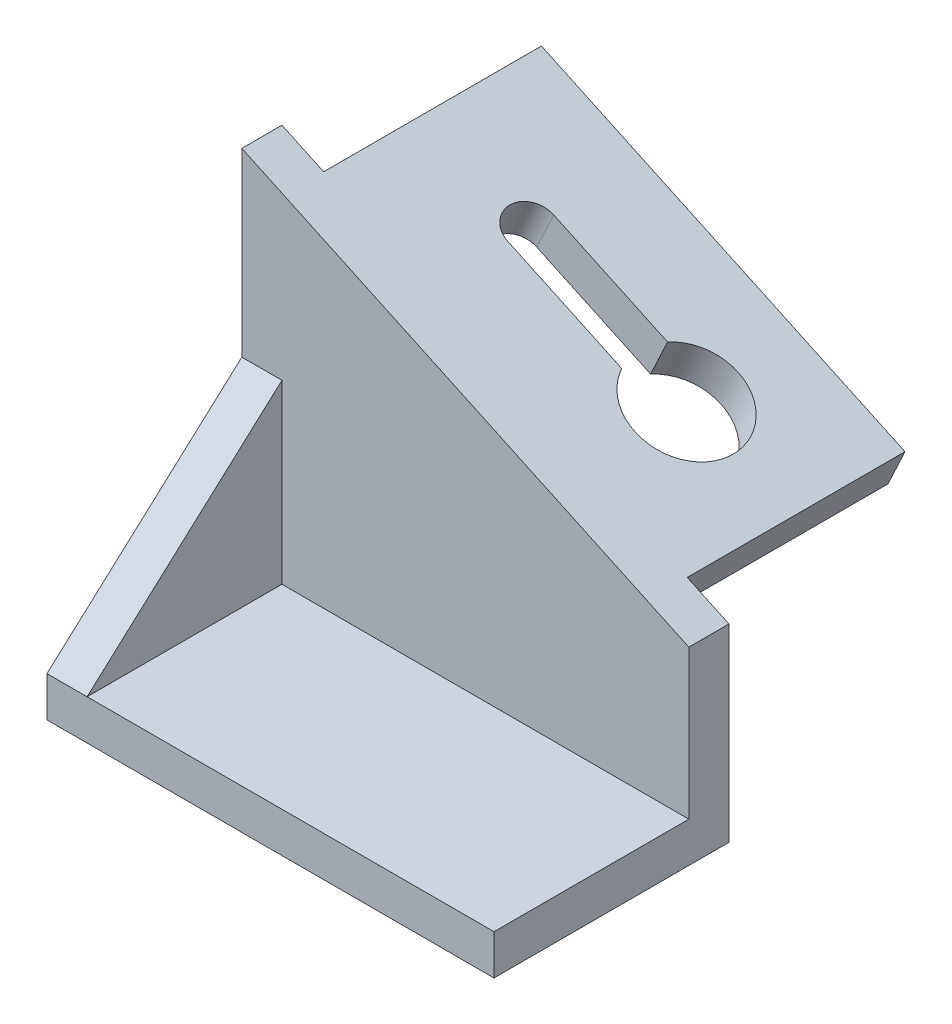
ISO-10303-21;
HEADER;
FILE_DESCRIPTION(('STEP AP214'),'2;1');
FILE_NAME('part.step','',(''),(''),'','','');
FILE_SCHEMA(('AUTOMOTIVE_DESIGN { 1 0 10303 214 1 1 1 1 }'));
ENDSEC;
DATA;
#1=APPLICATION_CONTEXT('core data for automotive mechanical design processes');
#2=APPLICATION_PROTOCOL_DEFINITION('international standard','automotive_design',2000,#1);
#3=PRODUCT_CONTEXT('',#1,'mechanical');
#4=PRODUCT('Part','Part','',(#3));
#5=PRODUCT_RELATED_PRODUCT_CATEGORY('part','',(#4));
#6=PRODUCT_DEFINITION_FORMATION('','',#4);
#7=PRODUCT_DEFINITION_CONTEXT('part definition',#1,'design');
#8=PRODUCT_DEFINITION('design','',#6,#7);
#9=PRODUCT_DEFINITION_SHAPE('','',#8);
#10=(LENGTH_UNIT() NAMED_UNIT(*) SI_UNIT(.MILLI.,.METRE.));
#11=(NAMED_UNIT(*) PLANE_ANGLE_UNIT() SI_UNIT($,.RADIAN.));
#12=(NAMED_UNIT(*) SI_UNIT($,.STERADIAN.) SOLID_ANGLE_UNIT());
#13=UNCERTAINTY_MEASURE_WITH_UNIT(LENGTH_MEASURE(1.E-05),#10,'distance_accuracy_value','');
#14=(GEOMETRIC_REPRESENTATION_CONTEXT(3) GLOBAL_UNCERTAINTY_ASSIGNED_CONTEXT((#13)) GLOBAL_UNIT_ASSIGNED_CONTEXT((#10,
#11,#12)) REPRESENTATION_CONTEXT('',''));
#15=CARTESIAN_POINT('',(0.,0.,0.));
#16=DIRECTION('',(0.,0.,1.));
#17=DIRECTION('',(1.,0.,0.));
#18=AXIS2_PLACEMENT_3D('',#15,#16,#17);
#19=CARTESIAN_POINT('',(39.,7.,17.));
#20=DIRECTION('',(-1.,0.,0.));
#21=DIRECTION('',(0.,0.,1.));
#22=AXIS2_PLACEMENT_3D('',#19,#20,#21);
#23=PLANE('',#22);
#24=DIRECTION('',(0.,0.,-1.));
#25=VECTOR('',#24,1.);
#26=CARTESIAN_POINT('',(39.,0.,17.));
#27=LINE('',#26,#25);
#28=CARTESIAN_POINT('',(39.,0.,17.));
#29=VERTEX_POINT('',#28);
#30=CARTESIAN_POINT('',(39.,0.,-24.));
#31=VERTEX_POINT('',#30);
#32=EDGE_CURVE('E253',#29,#31,#27,.T.);
#33=ORIENTED_EDGE('',*,*,#32,.T.);
#34=DIRECTION('',(0.,-1.,0.));
#35=VECTOR('',#34,1.);
#36=CARTESIAN_POINT('',(39.,0.,-24.));
#37=LINE('',#36,#35);
#38=CARTESIAN_POINT('',(39.,33.,-24.));
#39=VERTEX_POINT('',#38);
#40=EDGE_CURVE('E225',#39,#31,#37,.T.);
#41=ORIENTED_EDGE('',*,*,#40,.F.);
#42=DIRECTION('',(0.,0.,1.));
#43=VECTOR('',#42,1.);
#44=CARTESIAN_POINT('',(39.,33.,-24.));
#45=LINE('',#44,#43);
#46=CARTESIAN_POINT('',(39.,33.,-17.));
#47=VERTEX_POINT('',#46);
#48=EDGE_CURVE('E228',#39,#47,#45,.T.);
#49=ORIENTED_EDGE('',*,*,#48,.T.);
#50=DIRECTION('',(0.,-1.,0.));
#51=VECTOR('',#50,1.);
#52=CARTESIAN_POINT('',(39.,0.,-17.));
#53=LINE('',#52,#51);
#54=CARTESIAN_POINT('',(39.,7.,-17.));
#55=VERTEX_POINT('',#54);
#56=EDGE_CURVE('E219',#47,#55,#53,.T.);
#57=ORIENTED_EDGE('',*,*,#56,.T.);
#58=DIRECTION('',(0.,0.,-1.));
#59=VECTOR('',#58,1.);
#60=CARTESIAN_POINT('',(39.,7.,17.));
#61=LINE('',#60,#59);
#62=CARTESIAN_POINT('',(39.,7.,17.));
#63=VERTEX_POINT('',#62);
#64=EDGE_CURVE('E254',#63,#55,#61,.T.);
#65=ORIENTED_EDGE('',*,*,#64,.F.);
#66=DIRECTION('',(0.,-1.,0.));
#67=VECTOR('',#66,1.);
#68=CARTESIAN_POINT('',(39.,7.,17.));
#69=LINE('',#68,#67);
#70=EDGE_CURVE('E46',#63,#29,#69,.T.);
#71=ORIENTED_EDGE('',*,*,#70,.T.);
#72=EDGE_LOOP('',(#33,#41,#49,#57,#65,#71));
#73=FACE_BOUND('',#72,.T.);
#74=ADVANCED_FACE('F39',(#73),#23,.F.);
#75=CARTESIAN_POINT('',(-39.,7.,17.));
#76=DIRECTION('',(1.,0.,0.));
#77=DIRECTION('',(0.,0.,-1.));
#78=AXIS2_PLACEMENT_3D('',#75,#76,#77);
#79=PLANE('',#78);
#80=DIRECTION('',(0.,0.,1.));
#81=VECTOR('',#80,1.);
#82=CARTESIAN_POINT('',(-39.,0.,17.));
#83=LINE('',#82,#81);
#84=CARTESIAN_POINT('',(-39.,0.,-24.));
#85=VERTEX_POINT('',#84);
#86=CARTESIAN_POINT('',(-39.,0.,17.));
#87=VERTEX_POINT('',#86);
#88=EDGE_CURVE('E266',#85,#87,#83,.T.);
#89=ORIENTED_EDGE('',*,*,#88,.T.);
#90=DIRECTION('',(0.,-1.,0.));
#91=VECTOR('',#90,1.);
#92=CARTESIAN_POINT('',(-39.,7.,17.));
#93=LINE('',#92,#91);
#94=CARTESIAN_POINT('',(-39.,7.,17.));
#95=VERTEX_POINT('',#94);
#96=EDGE_CURVE('E11',#95,#87,#93,.T.);
#97=ORIENTED_EDGE('',*,*,#96,.F.);
#98=DIRECTION('',(0.,0.671603809480536,-0.740910469011764));
#99=VECTOR('',#98,1.);
#100=CARTESIAN_POINT('',(-39.,7.,17.));
#101=LINE('',#100,#99);
#102=CARTESIAN_POINT('',(-39.,37.8195530733899,-17.));
#103=VERTEX_POINT('',#102);
#104=EDGE_CURVE('E239',#95,#103,#101,.T.);
#105=ORIENTED_EDGE('',*,*,#104,.T.);
#106=DIRECTION('',(0.,1.,0.));
#107=VECTOR('',#106,1.);
#108=CARTESIAN_POINT('',(-39.,0.,-17.));
#109=LINE('',#108,#107);
#110=CARTESIAN_POINT('',(-39.,69.37199733609,-17.));
#111=VERTEX_POINT('',#110);
#112=EDGE_CURVE('E208',#103,#111,#109,.T.);
#113=ORIENTED_EDGE('',*,*,#112,.T.);
#114=DIRECTION('',(0.,0.,1.));
#115=VECTOR('',#114,1.);
#116=CARTESIAN_POINT('',(-39.,69.37199733609,-24.));
#117=LINE('',#116,#115);
#118=CARTESIAN_POINT('',(-39.,69.37199733609,-24.));
#119=VERTEX_POINT('',#118);
#120=EDGE_CURVE('E236',#119,#111,#117,.T.);
#121=ORIENTED_EDGE('',*,*,#120,.F.);
#122=DIRECTION('',(0.,1.,0.));
#123=VECTOR('',#122,1.);
#124=CARTESIAN_POINT('',(-39.,0.,-24.));
#125=LINE('',#124,#123);
#126=EDGE_CURVE('E218',#85,#119,#125,.T.);
#127=ORIENTED_EDGE('',*,*,#126,.F.);
#128=EDGE_LOOP('',(#89,#97,#105,#113,#121,#127));
#129=FACE_BOUND('',#128,.T.);
#130=ADVANCED_FACE('F302',(#129),#79,.F.);
#131=CARTESIAN_POINT('',(-39.,7.,17.));
#132=DIRECTION('',(0.,0.,-1.));
#133=DIRECTION('',(-1.,0.,0.));
#134=AXIS2_PLACEMENT_3D('',#131,#132,#133);
#135=PLANE('',#134);
#136=DIRECTION('',(1.,0.,0.));
#137=VECTOR('',#136,1.);
#138=CARTESIAN_POINT('',(-39.,0.,17.));
#139=LINE('',#138,#137);
#140=EDGE_CURVE('E258',#87,#29,#139,.T.);
#141=ORIENTED_EDGE('',*,*,#140,.T.);
#142=ORIENTED_EDGE('',*,*,#70,.F.);
#143=DIRECTION('',(1.,0.,0.));
#144=VECTOR('',#143,1.);
#145=CARTESIAN_POINT('',(-39.,7.,17.));
#146=LINE('',#145,#144);
#147=CARTESIAN_POINT('',(-32.,7.,17.));
#148=VERTEX_POINT('',#147);
#149=EDGE_CURVE('E261',#148,#63,#146,.T.);
#150=ORIENTED_EDGE('',*,*,#149,.F.);
#151=EDGE_CURVE('E262',#95,#148,#146,.T.);
#152=ORIENTED_EDGE('',*,*,#151,.F.);
#153=ORIENTED_EDGE('',*,*,#96,.T.);
#154=EDGE_LOOP('',(#141,#142,#150,#152,#153));
#155=FACE_BOUND('',#154,.T.);
#156=ADVANCED_FACE('F297',(#155),#135,.F.);
#157=CARTESIAN_POINT('',(0.,7.,0.));
#158=DIRECTION('',(0.,-1.,0.));
#159=DIRECTION('',(0.,0.,-1.));
#160=AXIS2_PLACEMENT_3D('',#157,#158,#159);
#161=PLANE('',#160);
#162=DIRECTION('',(-1.,0.,0.));
#163=VECTOR('',#162,1.);
#164=CARTESIAN_POINT('',(-39.,7.,-17.));
#165=LINE('',#164,#163);
#166=CARTESIAN_POINT('',(-32.,7.,-17.));
#167=VERTEX_POINT('',#166);
#168=EDGE_CURVE('E257',#55,#167,#165,.T.);
#169=ORIENTED_EDGE('',*,*,#168,.T.);
#170=DIRECTION('',(0.,0.,1.));
#171=VECTOR('',#170,1.);
#172=CARTESIAN_POINT('',(-32.,7.,17.));
#173=LINE('',#172,#171);
#174=EDGE_CURVE('E240',#167,#148,#173,.T.);
#175=ORIENTED_EDGE('',*,*,#174,.T.);
#176=ORIENTED_EDGE('',*,*,#149,.T.);
#177=ORIENTED_EDGE('',*,*,#64,.T.);
#178=EDGE_LOOP('',(#169,#175,#176,#177));
#179=FACE_BOUND('',#178,.T.);
#180=ADVANCED_FACE('F295',(#179),#161,.F.);
#181=CARTESIAN_POINT('',(0.,0.,0.));
#182=DIRECTION('',(0.,-1.,0.));
#183=DIRECTION('',(0.,0.,-1.));
#184=AXIS2_PLACEMENT_3D('',#181,#182,#183);
#185=PLANE('',#184);
#186=ORIENTED_EDGE('',*,*,#32,.F.);
#187=ORIENTED_EDGE('',*,*,#140,.F.);
#188=ORIENTED_EDGE('',*,*,#88,.F.);
#189=DIRECTION('',(-1.,0.,0.));
#190=VECTOR('',#189,1.);
#191=CARTESIAN_POINT('',(39.,0.,-24.));
#192=LINE('',#191,#190);
#193=EDGE_CURVE('E215',#31,#85,#192,.T.);
#194=ORIENTED_EDGE('',*,*,#193,.F.);
#195=EDGE_LOOP('',(#186,#187,#188,#194));
#196=FACE_BOUND('',#195,.T.);
#197=ADVANCED_FACE('F279',(#196),#185,.T.);
#198=CARTESIAN_POINT('',(-32.,7.,17.));
#199=DIRECTION('',(0.,0.740910469011764,0.671603809480536));
#200=DIRECTION('',(0.,-0.671603809480536,0.740910469011764));
#201=AXIS2_PLACEMENT_3D('',#198,#199,#200);
#202=PLANE('',#201);
#203=ORIENTED_EDGE('',*,*,#104,.F.);
#204=ORIENTED_EDGE('',*,*,#151,.T.);
#205=DIRECTION('',(0.,0.671603809480536,-0.740910469011764));
#206=VECTOR('',#205,1.);
#207=CARTESIAN_POINT('',(-32.,7.,17.));
#208=LINE('',#207,#206);
#209=CARTESIAN_POINT('',(-32.,37.8195530733899,-17.));
#210=VERTEX_POINT('',#209);
#211=EDGE_CURVE('E243',#148,#210,#208,.T.);
#212=ORIENTED_EDGE('',*,*,#211,.T.);
#213=DIRECTION('',(-1.,0.,0.));
#214=VECTOR('',#213,1.);
#215=CARTESIAN_POINT('',(-32.,37.8195530733899,-17.));
#216=LINE('',#215,#214);
#217=EDGE_CURVE('E248',#210,#103,#216,.T.);
#218=ORIENTED_EDGE('',*,*,#217,.T.);
#219=EDGE_LOOP('',(#203,#204,#212,#218));
#220=FACE_BOUND('',#219,.T.);
#221=ADVANCED_FACE('F300',(#220),#202,.T.);
#222=CARTESIAN_POINT('',(-32.,0.,0.));
#223=DIRECTION('',(-1.,0.,0.));
#224=DIRECTION('',(0.,0.,1.));
#225=AXIS2_PLACEMENT_3D('',#222,#223,#224);
#226=PLANE('',#225);
#227=ORIENTED_EDGE('',*,*,#174,.F.);
#228=DIRECTION('',(0.,-1.,0.));
#229=VECTOR('',#228,1.);
#230=CARTESIAN_POINT('',(-32.,37.8195530733899,-17.));
#231=LINE('',#230,#229);
#232=EDGE_CURVE('E246',#210,#167,#231,.T.);
#233=ORIENTED_EDGE('',*,*,#232,.F.);
#234=ORIENTED_EDGE('',*,*,#211,.F.);
#235=EDGE_LOOP('',(#227,#233,#234));
#236=FACE_BOUND('',#235,.T.);
#237=ADVANCED_FACE('F341',(#236),#226,.F.);
#238=CARTESIAN_POINT('',(39.,33.,-24.));
#239=DIRECTION('',(-0.422618261740701,-0.906307787036649,0.));
#240=DIRECTION('',(0.906307787036649,-0.422618261740701,0.));
#241=AXIS2_PLACEMENT_3D('',#238,#239,#240);
#242=PLANE('',#241);
#243=DIRECTION('',(0.906307787036649,-0.422618261740701,0.));
#244=VECTOR('',#243,1.);
#245=CARTESIAN_POINT('',(6.28772982717021,48.2539820972259,-38.));
#246=LINE('',#245,#244);
#247=CARTESIAN_POINT('',(-13.5946168055498,57.5252725941555,-38.));
#248=VERTEX_POINT('',#247);
#249=CARTESIAN_POINT('',(6.28772982717021,48.2539820972259,-38.));
#250=VERTEX_POINT('',#249);
#251=EDGE_CURVE('E175',#248,#250,#246,.T.);
#252=ORIENTED_EDGE('',*,*,#251,.F.);
#253=CARTESIAN_POINT('',(-13.5946168055497,57.5252725941555,-42.));
#254=DIRECTION('',(0.422618261740701,0.906307787036649,0.));
#255=DIRECTION('',(-0.906307787036649,0.422618261740701,0.));
#256=AXIS2_PLACEMENT_3D('',#253,#254,#255);
#257=CIRCLE('',#256,4.);
#258=CARTESIAN_POINT('',(-13.5946168055497,57.5252725941555,-46.));
#259=VERTEX_POINT('',#258);
#260=EDGE_CURVE('E53',#259,#248,#257,.T.);
#261=ORIENTED_EDGE('',*,*,#260,.F.);
#262=DIRECTION('',(-0.906307787036649,0.422618261740701,0.));
#263=VECTOR('',#262,1.);
#264=CARTESIAN_POINT('',(6.28772982717021,48.2539820972259,-46.));
#265=LINE('',#264,#263);
#266=CARTESIAN_POINT('',(6.28772982717021,48.2539820972259,-46.));
#267=VERTEX_POINT('',#266);
#268=EDGE_CURVE('E166',#267,#259,#265,.T.);
#269=ORIENTED_EDGE('',*,*,#268,.F.);
#270=CARTESIAN_POINT('',(13.5946168055497,44.8467247419345,-42.));
#271=DIRECTION('',(0.422618261740701,0.906307787036649,0.));
#272=DIRECTION('',(-0.906307787036649,0.422618261740701,0.));
#273=AXIS2_PLACEMENT_3D('',#270,#271,#272);
#274=CIRCLE('',#273,9.);
#275=EDGE_CURVE('E169',#250,#267,#274,.T.);
#276=ORIENTED_EDGE('',*,*,#275,.F.);
#277=EDGE_LOOP('',(#252,#261,#269,#276));
#278=FACE_BOUND('',#277,.T.);
#279=DIRECTION('',(0.906307787036649,-0.422618261740701,0.));
#280=VECTOR('',#279,1.);
#281=CARTESIAN_POINT('',(39.,33.,-17.));
#282=LINE('',#281,#280);
#283=EDGE_CURVE('E230',#111,#47,#282,.T.);
#284=ORIENTED_EDGE('',*,*,#283,.T.);
#285=ORIENTED_EDGE('',*,*,#48,.F.);
#286=DIRECTION('',(0.906307787036649,-0.422618261740701,0.));
#287=VECTOR('',#286,1.);
#288=CARTESIAN_POINT('',(39.,33.,-24.));
#289=LINE('',#288,#287);
#290=CARTESIAN_POINT('',(31.7207725462827,36.3943595071205,-24.));
#291=VERTEX_POINT('',#290);
#292=EDGE_CURVE('E221',#291,#39,#289,.T.);
#293=ORIENTED_EDGE('',*,*,#292,.F.);
#294=DIRECTION('',(0.,0.,-1.));
#295=VECTOR('',#294,1.);
#296=CARTESIAN_POINT('',(31.7207725462827,36.3943595071205,-24.));
#297=LINE('',#296,#295);
#298=CARTESIAN_POINT('',(31.7207725462827,36.3943595071205,-62.));
#299=VERTEX_POINT('',#298);
#300=EDGE_CURVE('E201',#291,#299,#297,.T.);
#301=ORIENTED_EDGE('',*,*,#300,.T.);
#302=DIRECTION('',(-0.906307787036649,0.422618261740701,0.));
#303=VECTOR('',#302,1.);
#304=CARTESIAN_POINT('',(-31.7207725462827,65.9776378289696,-62.));
#305=LINE('',#304,#303);
#306=CARTESIAN_POINT('',(-31.7207725462827,65.9776378289696,-62.));
#307=VERTEX_POINT('',#306);
#308=EDGE_CURVE('E189',#299,#307,#305,.T.);
#309=ORIENTED_EDGE('',*,*,#308,.T.);
#310=DIRECTION('',(0.,0.,1.));
#311=VECTOR('',#310,1.);
#312=CARTESIAN_POINT('',(-31.7207725462827,65.9776378289696,-24.));
#313=LINE('',#312,#311);
#314=CARTESIAN_POINT('',(-31.7207725462827,65.9776378289696,-24.));
#315=VERTEX_POINT('',#314);
#316=EDGE_CURVE('E181',#307,#315,#313,.T.);
#317=ORIENTED_EDGE('',*,*,#316,.T.);
#318=EDGE_CURVE('E222',#119,#315,#289,.T.);
#319=ORIENTED_EDGE('',*,*,#318,.F.);
#320=ORIENTED_EDGE('',*,*,#120,.T.);
#321=EDGE_LOOP('',(#284,#285,#293,#301,#309,#317,#319,#320));
#322=FACE_BOUND('',#321,.T.);
#323=ADVANCED_FACE('F304',(#278,#322),#242,.F.);
#324=CARTESIAN_POINT('',(0.,0.,-24.));
#325=DIRECTION('',(0.,0.,-1.));
#326=DIRECTION('',(-1.,0.,0.));
#327=AXIS2_PLACEMENT_3D('',#324,#325,#326);
#328=PLANE('',#327);
#329=DIRECTION('',(0.422618261740701,0.906307787036649,0.));
#330=VECTOR('',#329,1.);
#331=CARTESIAN_POINT('',(-34.6791003784676,59.633483319713,-24.));
#332=LINE('',#331,#330);
#333=CARTESIAN_POINT('',(-34.6791003784676,59.633483319713,-24.));
#334=VERTEX_POINT('',#333);
#335=EDGE_CURVE('E198',#334,#315,#332,.T.);
#336=ORIENTED_EDGE('',*,*,#335,.F.);
#337=DIRECTION('',(0.906307787036649,-0.422618261740701,0.));
#338=VECTOR('',#337,1.);
#339=CARTESIAN_POINT('',(-34.6791003784676,59.633483319713,-24.));
#340=LINE('',#339,#338);
#341=CARTESIAN_POINT('',(28.7624447140978,30.050204997864,-24.));
#342=VERTEX_POINT('',#341);
#343=EDGE_CURVE('E188',#334,#342,#340,.T.);
#344=ORIENTED_EDGE('',*,*,#343,.T.);
#345=DIRECTION('',(0.422618261740701,0.906307787036649,0.));
#346=VECTOR('',#345,1.);
#347=CARTESIAN_POINT('',(28.7624447140978,30.050204997864,-24.));
#348=LINE('',#347,#346);
#349=EDGE_CURVE('E211',#342,#291,#348,.T.);
#350=ORIENTED_EDGE('',*,*,#349,.T.);
#351=ORIENTED_EDGE('',*,*,#292,.T.);
#352=ORIENTED_EDGE('',*,*,#40,.T.);
#353=ORIENTED_EDGE('',*,*,#193,.T.);
#354=ORIENTED_EDGE('',*,*,#126,.T.);
#355=ORIENTED_EDGE('',*,*,#318,.T.);
#356=EDGE_LOOP('',(#336,#344,#350,#351,#352,#353,#354,#355));
#357=FACE_BOUND('',#356,.T.);
#358=ADVANCED_FACE('F283',(#357),#328,.T.);
#359=CARTESIAN_POINT('',(0.,0.,-17.));
#360=DIRECTION('',(0.,0.,-1.));
#361=DIRECTION('',(-1.,0.,0.));
#362=AXIS2_PLACEMENT_3D('',#359,#360,#361);
#363=PLANE('',#362);
#364=ORIENTED_EDGE('',*,*,#217,.F.);
#365=ORIENTED_EDGE('',*,*,#232,.T.);
#366=ORIENTED_EDGE('',*,*,#168,.F.);
#367=ORIENTED_EDGE('',*,*,#56,.F.);
#368=ORIENTED_EDGE('',*,*,#283,.F.);
#369=ORIENTED_EDGE('',*,*,#112,.F.);
#370=EDGE_LOOP('',(#364,#365,#366,#367,#368,#369));
#371=FACE_BOUND('',#370,.T.);
#372=ADVANCED_FACE('F291',(#371),#363,.F.);
#373=CARTESIAN_POINT('',(-34.6791003784676,59.633483319713,-24.));
#374=DIRECTION('',(-0.906307787036649,0.422618261740701,0.));
#375=DIRECTION('',(-0.422618261740701,-0.906307787036649,0.));
#376=AXIS2_PLACEMENT_3D('',#373,#374,#375);
#377=PLANE('',#376);
#378=ORIENTED_EDGE('',*,*,#316,.F.);
#379=DIRECTION('',(0.422618261740701,0.906307787036649,0.));
#380=VECTOR('',#379,1.);
#381=CARTESIAN_POINT('',(-34.6791003784676,59.633483319713,-62.));
#382=LINE('',#381,#380);
#383=CARTESIAN_POINT('',(-34.6791003784676,59.633483319713,-62.));
#384=VERTEX_POINT('',#383);
#385=EDGE_CURVE('E206',#384,#307,#382,.T.);
#386=ORIENTED_EDGE('',*,*,#385,.F.);
#387=DIRECTION('',(0.,0.,1.));
#388=VECTOR('',#387,1.);
#389=CARTESIAN_POINT('',(-34.6791003784676,59.633483319713,-24.));
#390=LINE('',#389,#388);
#391=EDGE_CURVE('E185',#384,#334,#390,.T.);
#392=ORIENTED_EDGE('',*,*,#391,.T.);
#393=ORIENTED_EDGE('',*,*,#335,.T.);
#394=EDGE_LOOP('',(#378,#386,#392,#393));
#395=FACE_BOUND('',#394,.T.);
#396=ADVANCED_FACE('F307',(#395),#377,.T.);
#397=CARTESIAN_POINT('',(-34.6791003784676,59.633483319713,-62.));
#398=DIRECTION('',(0.,0.,-1.));
#399=DIRECTION('',(-1.,0.,0.));
#400=AXIS2_PLACEMENT_3D('',#397,#398,#399);
#401=PLANE('',#400);
#402=ORIENTED_EDGE('',*,*,#308,.F.);
#403=DIRECTION('',(0.422618261740701,0.906307787036649,0.));
#404=VECTOR('',#403,1.);
#405=CARTESIAN_POINT('',(28.7624447140978,30.050204997864,-62.));
#406=LINE('',#405,#404);
#407=CARTESIAN_POINT('',(28.7624447140978,30.050204997864,-62.));
#408=VERTEX_POINT('',#407);
#409=EDGE_CURVE('E209',#408,#299,#406,.T.);
#410=ORIENTED_EDGE('',*,*,#409,.F.);
#411=DIRECTION('',(-0.906307787036649,0.422618261740701,0.));
#412=VECTOR('',#411,1.);
#413=CARTESIAN_POINT('',(-34.6791003784676,59.633483319713,-62.));
#414=LINE('',#413,#412);
#415=EDGE_CURVE('E195',#408,#384,#414,.T.);
#416=ORIENTED_EDGE('',*,*,#415,.T.);
#417=ORIENTED_EDGE('',*,*,#385,.T.);
#418=EDGE_LOOP('',(#402,#410,#416,#417));
#419=FACE_BOUND('',#418,.T.);
#420=ADVANCED_FACE('F313',(#419),#401,.T.);
#421=CARTESIAN_POINT('',(28.7624447140978,30.050204997864,-24.));
#422=DIRECTION('',(0.906307787036649,-0.422618261740701,0.));
#423=DIRECTION('',(0.422618261740701,0.906307787036649,0.));
#424=AXIS2_PLACEMENT_3D('',#421,#422,#423);
#425=PLANE('',#424);
#426=ORIENTED_EDGE('',*,*,#300,.F.);
#427=ORIENTED_EDGE('',*,*,#349,.F.);
#428=DIRECTION('',(0.,0.,-1.));
#429=VECTOR('',#428,1.);
#430=CARTESIAN_POINT('',(28.7624447140978,30.050204997864,-24.));
#431=LINE('',#430,#429);
#432=EDGE_CURVE('E192',#342,#408,#431,.T.);
#433=ORIENTED_EDGE('',*,*,#432,.T.);
#434=ORIENTED_EDGE('',*,*,#409,.T.);
#435=EDGE_LOOP('',(#426,#427,#433,#434));
#436=FACE_BOUND('',#435,.T.);
#437=ADVANCED_FACE('F315',(#436),#425,.T.);
#438=CARTESIAN_POINT('',(16.6470470903908,35.6997076913915,0.));
#439=DIRECTION('',(-0.422618261740701,-0.906307787036649,0.));
#440=DIRECTION('',(0.906307787036649,-0.422618261740701,0.));
#441=AXIS2_PLACEMENT_3D('',#438,#439,#440);
#442=PLANE('',#441);
#443=CARTESIAN_POINT('',(-16.5529446377347,51.181118084899,-42.));
#444=DIRECTION('',(0.422618261740701,0.906307787036649,0.));
#445=DIRECTION('',(-0.906307787036649,0.422618261740701,0.));
#446=AXIS2_PLACEMENT_3D('',#443,#444,#445);
#447=CIRCLE('',#446,4.);
#448=CARTESIAN_POINT('',(-16.5529446377347,51.181118084899,-46.));
#449=VERTEX_POINT('',#448);
#450=CARTESIAN_POINT('',(-16.5529446377347,51.181118084899,-38.));
#451=VERTEX_POINT('',#450);
#452=EDGE_CURVE('E150',#449,#451,#447,.T.);
#453=ORIENTED_EDGE('',*,*,#452,.T.);
#454=DIRECTION('',(0.906307787036649,-0.422618261740701,0.));
#455=VECTOR('',#454,1.);
#456=CARTESIAN_POINT('',(3.3294019949853,41.9098275879694,-38.));
#457=LINE('',#456,#455);
#458=CARTESIAN_POINT('',(3.32940199498537,41.9098275879694,-38.));
#459=VERTEX_POINT('',#458);
#460=EDGE_CURVE('E159',#451,#459,#457,.T.);
#461=ORIENTED_EDGE('',*,*,#460,.T.);
#462=CARTESIAN_POINT('',(10.6362889733648,38.502570232678,-42.));
#463=DIRECTION('',(0.422618261740701,0.906307787036649,0.));
#464=DIRECTION('',(-0.906307787036649,0.422618261740701,0.));
#465=AXIS2_PLACEMENT_3D('',#462,#463,#464);
#466=CIRCLE('',#465,9.);
#467=CARTESIAN_POINT('',(3.3294019949853,41.9098275879694,-46.));
#468=VERTEX_POINT('',#467);
#469=EDGE_CURVE('E61',#459,#468,#466,.T.);
#470=ORIENTED_EDGE('',*,*,#469,.T.);
#471=DIRECTION('',(-0.906307787036649,0.422618261740701,0.));
#472=VECTOR('',#471,1.);
#473=CARTESIAN_POINT('',(3.3294019949853,41.9098275879694,-46.));
#474=LINE('',#473,#472);
#475=EDGE_CURVE('E156',#468,#449,#474,.T.);
#476=ORIENTED_EDGE('',*,*,#475,.T.);
#477=EDGE_LOOP('',(#453,#461,#470,#476));
#478=FACE_BOUND('',#477,.T.);
#479=ORIENTED_EDGE('',*,*,#391,.F.);
#480=ORIENTED_EDGE('',*,*,#415,.F.);
#481=ORIENTED_EDGE('',*,*,#432,.F.);
#482=ORIENTED_EDGE('',*,*,#343,.F.);
#483=EDGE_LOOP('',(#479,#480,#481,#482));
#484=FACE_BOUND('',#483,.T.);
#485=ADVANCED_FACE('F163',(#478,#484),#442,.T.);
#486=CARTESIAN_POINT('',(-16.5529446377347,51.181118084899,-42.));
#487=DIRECTION('',(0.422618261740701,0.906307787036649,0.));
#488=DIRECTION('',(-0.906307787036649,0.422618261740701,0.));
#489=AXIS2_PLACEMENT_3D('',#486,#487,#488);
#490=CYLINDRICAL_SURFACE('',#489,4.);
#491=ORIENTED_EDGE('',*,*,#260,.T.);
#492=DIRECTION('',(0.422618261740701,0.906307787036649,0.));
#493=VECTOR('',#492,1.);
#494=CARTESIAN_POINT('',(-16.5529446377347,51.181118084899,-38.));
#495=LINE('',#494,#493);
#496=EDGE_CURVE('E146',#451,#248,#495,.T.);
#497=ORIENTED_EDGE('',*,*,#496,.F.);
#498=ORIENTED_EDGE('',*,*,#452,.F.);
#499=DIRECTION('',(0.422618261740701,0.906307787036649,0.));
#500=VECTOR('',#499,1.);
#501=CARTESIAN_POINT('',(-16.5529446377347,51.181118084899,-46.));
#502=LINE('',#501,#500);
#503=EDGE_CURVE('E179',#449,#259,#502,.T.);
#504=ORIENTED_EDGE('',*,*,#503,.T.);
#505=EDGE_LOOP('',(#491,#497,#498,#504));
#506=FACE_BOUND('',#505,.T.);
#507=ADVANCED_FACE('F148',(#506),#490,.F.);
#508=CARTESIAN_POINT('',(3.3294019949853,41.9098275879694,-46.));
#509=DIRECTION('',(0.,0.,-1.));
#510=DIRECTION('',(-1.,0.,0.));
#511=AXIS2_PLACEMENT_3D('',#508,#509,#510);
#512=PLANE('',#511);
#513=ORIENTED_EDGE('',*,*,#268,.T.);
#514=ORIENTED_EDGE('',*,*,#503,.F.);
#515=ORIENTED_EDGE('',*,*,#475,.F.);
#516=DIRECTION('',(0.422618261740701,0.906307787036649,0.));
#517=VECTOR('',#516,1.);
#518=CARTESIAN_POINT('',(3.3294019949853,41.9098275879694,-46.));
#519=LINE('',#518,#517);
#520=EDGE_CURVE('E182',#468,#267,#519,.T.);
#521=ORIENTED_EDGE('',*,*,#520,.T.);
#522=EDGE_LOOP('',(#513,#514,#515,#521));
#523=FACE_BOUND('',#522,.T.);
#524=ADVANCED_FACE('F381',(#523),#512,.F.);
#525=CARTESIAN_POINT('',(10.6362889733648,38.502570232678,-42.));
#526=DIRECTION('',(0.422618261740701,0.906307787036649,0.));
#527=DIRECTION('',(-0.906307787036649,0.422618261740701,0.));
#528=AXIS2_PLACEMENT_3D('',#525,#526,#527);
#529=CYLINDRICAL_SURFACE('',#528,9.);
#530=ORIENTED_EDGE('',*,*,#275,.T.);
#531=ORIENTED_EDGE('',*,*,#520,.F.);
#532=ORIENTED_EDGE('',*,*,#469,.F.);
#533=DIRECTION('',(0.422618261740701,0.906307787036649,0.));
#534=VECTOR('',#533,1.);
#535=CARTESIAN_POINT('',(3.3294019949853,41.9098275879694,-38.));
#536=LINE('',#535,#534);
#537=EDGE_CURVE('E155',#459,#250,#536,.T.);
#538=ORIENTED_EDGE('',*,*,#537,.T.);
#539=EDGE_LOOP('',(#530,#531,#532,#538));
#540=FACE_BOUND('',#539,.T.);
#541=ADVANCED_FACE('F390',(#540),#529,.F.);
#542=CARTESIAN_POINT('',(3.3294019949853,41.9098275879694,-38.));
#543=DIRECTION('',(0.,0.,1.));
#544=DIRECTION('',(1.,0.,0.));
#545=AXIS2_PLACEMENT_3D('',#542,#543,#544);
#546=PLANE('',#545);
#547=ORIENTED_EDGE('',*,*,#251,.T.);
#548=ORIENTED_EDGE('',*,*,#537,.F.);
#549=ORIENTED_EDGE('',*,*,#460,.F.);
#550=ORIENTED_EDGE('',*,*,#496,.T.);
#551=EDGE_LOOP('',(#547,#548,#549,#550));
#552=FACE_BOUND('',#551,.T.);
#553=ADVANCED_FACE('F160',(#552),#546,.F.);
#554=CLOSED_SHELL('',(#74,#130,#156,#180,#197,#221,#237,#323,#358,#372,#396,#420,#437,#485,#507,
#524,#541,#553));
#555=MANIFOLD_SOLID_BREP('B2',#554);
#556=ADVANCED_BREP_SHAPE_REPRESENTATION('',(#18,#555),#14);
#557=SHAPE_DEFINITION_REPRESENTATION(#9,#556);
ENDSEC;
END-ISO-10303-21;
